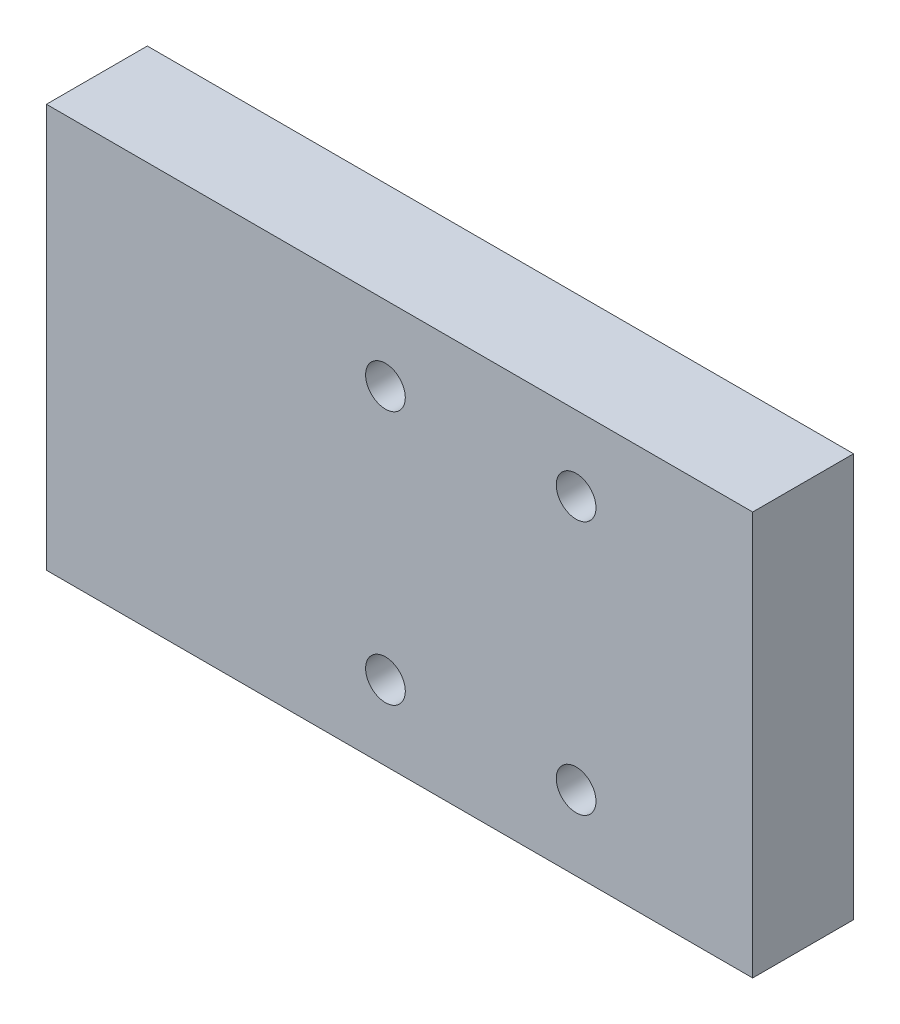
ISO-10303-21;
HEADER;
FILE_DESCRIPTION(('STEP AP214'),'2;1');
FILE_NAME('part.step','',(''),(''),'','','');
FILE_SCHEMA(('AUTOMOTIVE_DESIGN { 1 0 10303 214 1 1 1 1 }'));
ENDSEC;
DATA;
#1=APPLICATION_CONTEXT('core data for automotive mechanical design processes');
#2=APPLICATION_PROTOCOL_DEFINITION('international standard','automotive_design',2000,#1);
#3=PRODUCT_CONTEXT('',#1,'mechanical');
#4=PRODUCT('Part','Part','',(#3));
#5=PRODUCT_RELATED_PRODUCT_CATEGORY('part','',(#4));
#6=PRODUCT_DEFINITION_FORMATION('','',#4);
#7=PRODUCT_DEFINITION_CONTEXT('part definition',#1,'design');
#8=PRODUCT_DEFINITION('design','',#6,#7);
#9=PRODUCT_DEFINITION_SHAPE('','',#8);
#10=(LENGTH_UNIT() NAMED_UNIT(*) SI_UNIT(.MILLI.,.METRE.));
#11=(NAMED_UNIT(*) PLANE_ANGLE_UNIT() SI_UNIT($,.RADIAN.));
#12=(NAMED_UNIT(*) SI_UNIT($,.STERADIAN.) SOLID_ANGLE_UNIT());
#13=UNCERTAINTY_MEASURE_WITH_UNIT(LENGTH_MEASURE(1.E-05),#10,'distance_accuracy_value','');
#14=(GEOMETRIC_REPRESENTATION_CONTEXT(3) GLOBAL_UNCERTAINTY_ASSIGNED_CONTEXT((#13)) GLOBAL_UNIT_ASSIGNED_CONTEXT((#10,
#11,#12)) REPRESENTATION_CONTEXT('',''));
#15=CARTESIAN_POINT('',(0.,0.,0.));
#16=DIRECTION('',(0.,0.,1.));
#17=DIRECTION('',(1.,0.,0.));
#18=AXIS2_PLACEMENT_3D('',#15,#16,#17);
#19=CARTESIAN_POINT('',(-22.225,12.7,3.175));
#20=DIRECTION('',(1.,0.,0.));
#21=DIRECTION('',(0.,0.,-1.));
#22=AXIS2_PLACEMENT_3D('',#19,#20,#21);
#23=PLANE('',#22);
#24=DIRECTION('',(0.,-1.,0.));
#25=VECTOR('',#24,1.);
#26=CARTESIAN_POINT('',(-22.225,12.7,-3.175));
#27=LINE('',#26,#25);
#28=CARTESIAN_POINT('',(-22.225,12.7,-3.175));
#29=VERTEX_POINT('',#28);
#30=CARTESIAN_POINT('',(-22.225,-12.7,-3.175));
#31=VERTEX_POINT('',#30);
#32=EDGE_CURVE('E100',#29,#31,#27,.T.);
#33=ORIENTED_EDGE('',*,*,#32,.T.);
#34=DIRECTION('',(0.,0.,-1.));
#35=VECTOR('',#34,1.);
#36=CARTESIAN_POINT('',(-22.225,-12.7,3.175));
#37=LINE('',#36,#35);
#38=CARTESIAN_POINT('',(-22.225,-12.7,3.175));
#39=VERTEX_POINT('',#38);
#40=EDGE_CURVE('E11',#39,#31,#37,.T.);
#41=ORIENTED_EDGE('',*,*,#40,.F.);
#42=DIRECTION('',(0.,-1.,0.));
#43=VECTOR('',#42,1.);
#44=CARTESIAN_POINT('',(-22.225,12.7,3.175));
#45=LINE('',#44,#43);
#46=CARTESIAN_POINT('',(-22.225,12.7,3.175));
#47=VERTEX_POINT('',#46);
#48=EDGE_CURVE('E88',#47,#39,#45,.T.);
#49=ORIENTED_EDGE('',*,*,#48,.F.);
#50=DIRECTION('',(0.,0.,-1.));
#51=VECTOR('',#50,1.);
#52=CARTESIAN_POINT('',(-22.225,12.7,3.175));
#53=LINE('',#52,#51);
#54=EDGE_CURVE('E96',#47,#29,#53,.T.);
#55=ORIENTED_EDGE('',*,*,#54,.T.);
#56=EDGE_LOOP('',(#33,#41,#49,#55));
#57=FACE_BOUND('',#56,.T.);
#58=ADVANCED_FACE('F37',(#57),#23,.F.);
#59=CARTESIAN_POINT('',(-22.225,-12.7,3.175));
#60=DIRECTION('',(0.,1.,0.));
#61=DIRECTION('',(0.,0.,1.));
#62=AXIS2_PLACEMENT_3D('',#59,#60,#61);
#63=PLANE('',#62);
#64=DIRECTION('',(1.,0.,0.));
#65=VECTOR('',#64,1.);
#66=CARTESIAN_POINT('',(-22.225,-12.7,-3.175));
#67=LINE('',#66,#65);
#68=CARTESIAN_POINT('',(22.225,-12.7,-3.175));
#69=VERTEX_POINT('',#68);
#70=EDGE_CURVE('E92',#31,#69,#67,.T.);
#71=ORIENTED_EDGE('',*,*,#70,.T.);
#72=DIRECTION('',(0.,0.,-1.));
#73=VECTOR('',#72,1.);
#74=CARTESIAN_POINT('',(22.225,-12.7,3.175));
#75=LINE('',#74,#73);
#76=CARTESIAN_POINT('',(22.225,-12.7,3.175));
#77=VERTEX_POINT('',#76);
#78=EDGE_CURVE('E45',#77,#69,#75,.T.);
#79=ORIENTED_EDGE('',*,*,#78,.F.);
#80=DIRECTION('',(1.,0.,0.));
#81=VECTOR('',#80,1.);
#82=CARTESIAN_POINT('',(-22.225,-12.7,3.175));
#83=LINE('',#82,#81);
#84=EDGE_CURVE('E83',#39,#77,#83,.T.);
#85=ORIENTED_EDGE('',*,*,#84,.F.);
#86=ORIENTED_EDGE('',*,*,#40,.T.);
#87=EDGE_LOOP('',(#71,#79,#85,#86));
#88=FACE_BOUND('',#87,.T.);
#89=ADVANCED_FACE('F91',(#88),#63,.F.);
#90=CARTESIAN_POINT('',(22.225,12.7,3.175));
#91=DIRECTION('',(-1.,0.,0.));
#92=DIRECTION('',(0.,0.,1.));
#93=AXIS2_PLACEMENT_3D('',#90,#91,#92);
#94=PLANE('',#93);
#95=DIRECTION('',(0.,1.,0.));
#96=VECTOR('',#95,1.);
#97=CARTESIAN_POINT('',(22.225,12.7,-3.175));
#98=LINE('',#97,#96);
#99=CARTESIAN_POINT('',(22.225,12.7,-3.175));
#100=VERTEX_POINT('',#99);
#101=EDGE_CURVE('E70',#69,#100,#98,.T.);
#102=ORIENTED_EDGE('',*,*,#101,.T.);
#103=DIRECTION('',(0.,0.,-1.));
#104=VECTOR('',#103,1.);
#105=CARTESIAN_POINT('',(22.225,12.7,3.175));
#106=LINE('',#105,#104);
#107=CARTESIAN_POINT('',(22.225,12.7,3.175));
#108=VERTEX_POINT('',#107);
#109=EDGE_CURVE('E93',#108,#100,#106,.T.);
#110=ORIENTED_EDGE('',*,*,#109,.F.);
#111=DIRECTION('',(0.,1.,0.));
#112=VECTOR('',#111,1.);
#113=CARTESIAN_POINT('',(22.225,12.7,3.175));
#114=LINE('',#113,#112);
#115=EDGE_CURVE('E86',#77,#108,#114,.T.);
#116=ORIENTED_EDGE('',*,*,#115,.F.);
#117=ORIENTED_EDGE('',*,*,#78,.T.);
#118=EDGE_LOOP('',(#102,#110,#116,#117));
#119=FACE_BOUND('',#118,.T.);
#120=ADVANCED_FACE('F94',(#119),#94,.F.);
#121=CARTESIAN_POINT('',(-22.225,12.7,3.175));
#122=DIRECTION('',(0.,-1.,0.));
#123=DIRECTION('',(0.,0.,-1.));
#124=AXIS2_PLACEMENT_3D('',#121,#122,#123);
#125=PLANE('',#124);
#126=DIRECTION('',(-1.,0.,0.));
#127=VECTOR('',#126,1.);
#128=CARTESIAN_POINT('',(-22.225,12.7,-3.175));
#129=LINE('',#128,#127);
#130=EDGE_CURVE('E76',#100,#29,#129,.T.);
#131=ORIENTED_EDGE('',*,*,#130,.T.);
#132=ORIENTED_EDGE('',*,*,#54,.F.);
#133=DIRECTION('',(-1.,0.,0.));
#134=VECTOR('',#133,1.);
#135=CARTESIAN_POINT('',(-22.225,12.7,3.175));
#136=LINE('',#135,#134);
#137=EDGE_CURVE('E53',#108,#47,#136,.T.);
#138=ORIENTED_EDGE('',*,*,#137,.F.);
#139=ORIENTED_EDGE('',*,*,#109,.T.);
#140=EDGE_LOOP('',(#131,#132,#138,#139));
#141=FACE_BOUND('',#140,.T.);
#142=ADVANCED_FACE('F108',(#141),#125,.F.);
#143=CARTESIAN_POINT('',(0.,0.,3.175));
#144=DIRECTION('',(0.,0.,1.));
#145=DIRECTION('',(1.,0.,0.));
#146=AXIS2_PLACEMENT_3D('',#143,#144,#145);
#147=PLANE('',#146);
#148=CARTESIAN_POINT('',(-0.887500000000005,-8.,3.175));
#149=DIRECTION('',(0.,0.,-1.));
#150=DIRECTION('',(1.,0.,0.));
#151=AXIS2_PLACEMENT_3D('',#148,#149,#150);
#152=CIRCLE('',#151,1.24968);
#153=CARTESIAN_POINT('',(0.362179999999995,-8.,3.175));
#154=VERTEX_POINT('',#153);
#155=EDGE_CURVE('E132',#154,#154,#152,.T.);
#156=ORIENTED_EDGE('',*,*,#155,.T.);
#157=EDGE_LOOP('',(#156));
#158=FACE_BOUND('',#157,.T.);
#159=CARTESIAN_POINT('',(11.1125,-8.,3.175));
#160=DIRECTION('',(0.,0.,-1.));
#161=DIRECTION('',(1.,0.,0.));
#162=AXIS2_PLACEMENT_3D('',#159,#160,#161);
#163=CIRCLE('',#162,1.24968);
#164=CARTESIAN_POINT('',(12.36218,-8.,3.175));
#165=VERTEX_POINT('',#164);
#166=EDGE_CURVE('E126',#165,#165,#163,.T.);
#167=ORIENTED_EDGE('',*,*,#166,.T.);
#168=EDGE_LOOP('',(#167));
#169=FACE_BOUND('',#168,.T.);
#170=CARTESIAN_POINT('',(-0.887500000000005,8.,3.175));
#171=DIRECTION('',(0.,0.,1.));
#172=DIRECTION('',(1.,0.,0.));
#173=AXIS2_PLACEMENT_3D('',#170,#171,#172);
#174=CIRCLE('',#173,1.24968);
#175=CARTESIAN_POINT('',(0.362179999999995,8.,3.175));
#176=VERTEX_POINT('',#175);
#177=EDGE_CURVE('E121',#176,#176,#174,.T.);
#178=ORIENTED_EDGE('',*,*,#177,.F.);
#179=EDGE_LOOP('',(#178));
#180=FACE_BOUND('',#179,.T.);
#181=CARTESIAN_POINT('',(11.1125,8.,3.175));
#182=DIRECTION('',(0.,0.,1.));
#183=DIRECTION('',(1.,0.,0.));
#184=AXIS2_PLACEMENT_3D('',#181,#182,#183);
#185=CIRCLE('',#184,1.24968);
#186=CARTESIAN_POINT('',(12.36218,8.,3.175));
#187=VERTEX_POINT('',#186);
#188=EDGE_CURVE('E114',#187,#187,#185,.T.);
#189=ORIENTED_EDGE('',*,*,#188,.F.);
#190=EDGE_LOOP('',(#189));
#191=FACE_BOUND('',#190,.T.);
#192=ORIENTED_EDGE('',*,*,#48,.T.);
#193=ORIENTED_EDGE('',*,*,#84,.T.);
#194=ORIENTED_EDGE('',*,*,#115,.T.);
#195=ORIENTED_EDGE('',*,*,#137,.T.);
#196=EDGE_LOOP('',(#192,#193,#194,#195));
#197=FACE_BOUND('',#196,.T.);
#198=ADVANCED_FACE('F84',(#158,#169,#180,#191,#197),#147,.T.);
#199=CARTESIAN_POINT('',(0.,0.,-3.175));
#200=DIRECTION('',(0.,0.,1.));
#201=DIRECTION('',(1.,0.,0.));
#202=AXIS2_PLACEMENT_3D('',#199,#200,#201);
#203=PLANE('',#202);
#204=CARTESIAN_POINT('',(-0.887500000000005,-8.,-3.175));
#205=DIRECTION('',(0.,0.,-1.));
#206=DIRECTION('',(1.,0.,0.));
#207=AXIS2_PLACEMENT_3D('',#204,#205,#206);
#208=CIRCLE('',#207,1.24968);
#209=CARTESIAN_POINT('',(0.362179999999995,-8.,-3.175));
#210=VERTEX_POINT('',#209);
#211=EDGE_CURVE('E118',#210,#210,#208,.T.);
#212=ORIENTED_EDGE('',*,*,#211,.F.);
#213=EDGE_LOOP('',(#212));
#214=FACE_BOUND('',#213,.T.);
#215=CARTESIAN_POINT('',(11.1125,-8.,-3.175));
#216=DIRECTION('',(0.,0.,-1.));
#217=DIRECTION('',(1.,0.,0.));
#218=AXIS2_PLACEMENT_3D('',#215,#216,#217);
#219=CIRCLE('',#218,1.24968);
#220=CARTESIAN_POINT('',(12.36218,-8.,-3.175));
#221=VERTEX_POINT('',#220);
#222=EDGE_CURVE('E129',#221,#221,#219,.T.);
#223=ORIENTED_EDGE('',*,*,#222,.F.);
#224=EDGE_LOOP('',(#223));
#225=FACE_BOUND('',#224,.T.);
#226=CARTESIAN_POINT('',(-0.887500000000005,8.,-3.175));
#227=DIRECTION('',(0.,0.,1.));
#228=DIRECTION('',(1.,0.,0.));
#229=AXIS2_PLACEMENT_3D('',#226,#227,#228);
#230=CIRCLE('',#229,1.24968);
#231=CARTESIAN_POINT('',(0.362179999999995,8.,-3.175));
#232=VERTEX_POINT('',#231);
#233=EDGE_CURVE('E103',#232,#232,#230,.T.);
#234=ORIENTED_EDGE('',*,*,#233,.T.);
#235=EDGE_LOOP('',(#234));
#236=FACE_BOUND('',#235,.T.);
#237=CARTESIAN_POINT('',(11.1125,8.,-3.175));
#238=DIRECTION('',(0.,0.,1.));
#239=DIRECTION('',(1.,0.,0.));
#240=AXIS2_PLACEMENT_3D('',#237,#238,#239);
#241=CIRCLE('',#240,1.24968);
#242=CARTESIAN_POINT('',(12.36218,8.,-3.175));
#243=VERTEX_POINT('',#242);
#244=EDGE_CURVE('E117',#243,#243,#241,.T.);
#245=ORIENTED_EDGE('',*,*,#244,.T.);
#246=EDGE_LOOP('',(#245));
#247=FACE_BOUND('',#246,.T.);
#248=ORIENTED_EDGE('',*,*,#32,.F.);
#249=ORIENTED_EDGE('',*,*,#130,.F.);
#250=ORIENTED_EDGE('',*,*,#101,.F.);
#251=ORIENTED_EDGE('',*,*,#70,.F.);
#252=EDGE_LOOP('',(#248,#249,#250,#251));
#253=FACE_BOUND('',#252,.T.);
#254=ADVANCED_FACE('F111',(#214,#225,#236,#247,#253),#203,.F.);
#255=CARTESIAN_POINT('',(11.1125,8.,-3.175));
#256=DIRECTION('',(0.,0.,1.));
#257=DIRECTION('',(1.,0.,0.));
#258=AXIS2_PLACEMENT_3D('',#255,#256,#257);
#259=CYLINDRICAL_SURFACE('',#258,1.24968);
#260=ORIENTED_EDGE('',*,*,#244,.F.);
#261=EDGE_LOOP('',(#260));
#262=FACE_BOUND('',#261,.T.);
#263=ORIENTED_EDGE('',*,*,#188,.T.);
#264=EDGE_LOOP('',(#263));
#265=FACE_BOUND('',#264,.T.);
#266=ADVANCED_FACE('F143',(#262,#265),#259,.F.);
#267=CARTESIAN_POINT('',(-0.887500000000005,8.,-3.175));
#268=DIRECTION('',(0.,0.,1.));
#269=DIRECTION('',(1.,0.,0.));
#270=AXIS2_PLACEMENT_3D('',#267,#268,#269);
#271=CYLINDRICAL_SURFACE('',#270,1.24968);
#272=ORIENTED_EDGE('',*,*,#233,.F.);
#273=EDGE_LOOP('',(#272));
#274=FACE_BOUND('',#273,.T.);
#275=ORIENTED_EDGE('',*,*,#177,.T.);
#276=EDGE_LOOP('',(#275));
#277=FACE_BOUND('',#276,.T.);
#278=ADVANCED_FACE('F153',(#274,#277),#271,.F.);
#279=CARTESIAN_POINT('',(11.1125,-8.,-3.175));
#280=DIRECTION('',(0.,0.,1.));
#281=DIRECTION('',(1.,0.,0.));
#282=AXIS2_PLACEMENT_3D('',#279,#280,#281);
#283=CYLINDRICAL_SURFACE('',#282,1.24968);
#284=ORIENTED_EDGE('',*,*,#222,.T.);
#285=EDGE_LOOP('',(#284));
#286=FACE_BOUND('',#285,.T.);
#287=ORIENTED_EDGE('',*,*,#166,.F.);
#288=EDGE_LOOP('',(#287));
#289=FACE_BOUND('',#288,.T.);
#290=ADVANCED_FACE('F195',(#286,#289),#283,.F.);
#291=CARTESIAN_POINT('',(-0.887500000000005,-8.,-3.175));
#292=DIRECTION('',(0.,0.,1.));
#293=DIRECTION('',(1.,0.,0.));
#294=AXIS2_PLACEMENT_3D('',#291,#292,#293);
#295=CYLINDRICAL_SURFACE('',#294,1.24968);
#296=ORIENTED_EDGE('',*,*,#211,.T.);
#297=EDGE_LOOP('',(#296));
#298=FACE_BOUND('',#297,.T.);
#299=ORIENTED_EDGE('',*,*,#155,.F.);
#300=EDGE_LOOP('',(#299));
#301=FACE_BOUND('',#300,.T.);
#302=ADVANCED_FACE('F138',(#298,#301),#295,.F.);
#303=CLOSED_SHELL('',(#58,#89,#120,#142,#198,#254,#266,#278,#290,#302));
#304=MANIFOLD_SOLID_BREP('B2',#303);
#305=ADVANCED_BREP_SHAPE_REPRESENTATION('',(#18,#304),#14);
#306=SHAPE_DEFINITION_REPRESENTATION(#9,#305);
ENDSEC;
END-ISO-10303-21;
